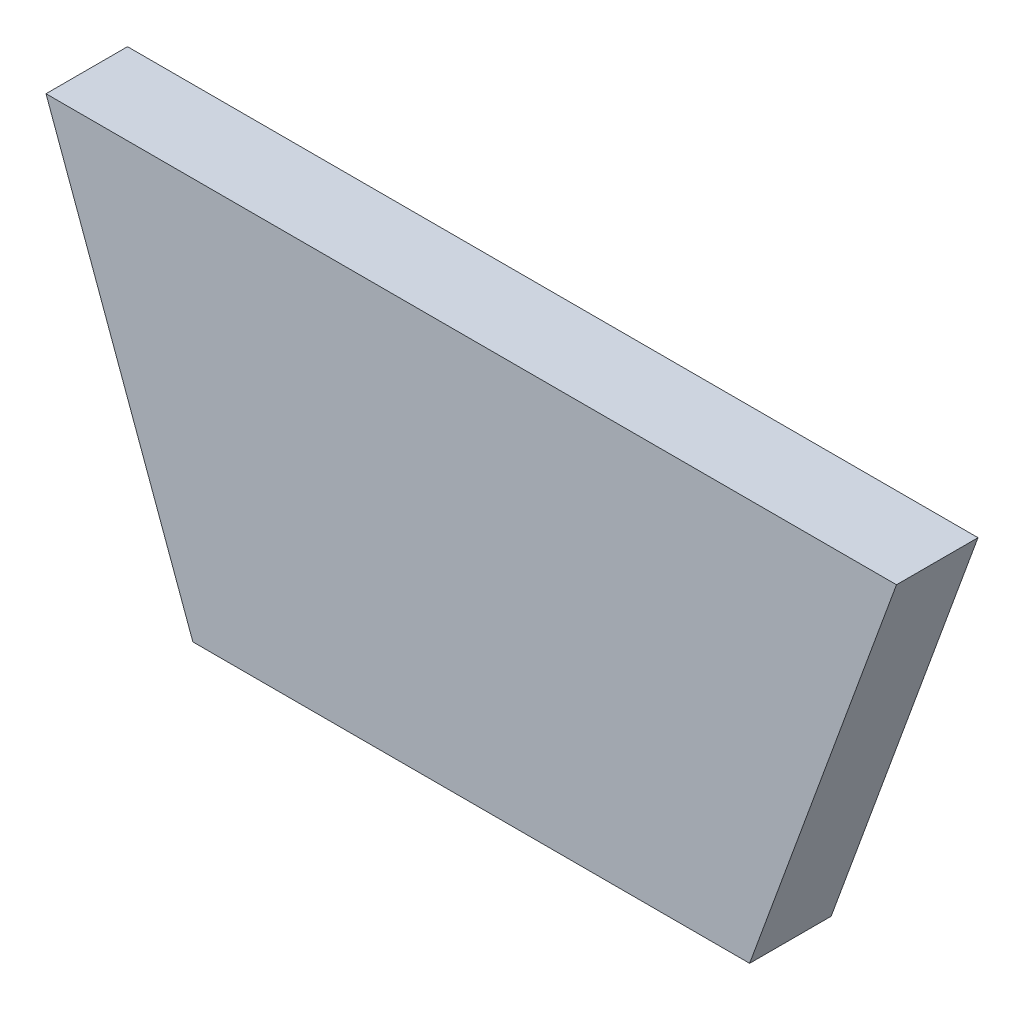
ISO-10303-21;
HEADER;
FILE_DESCRIPTION(('STEP AP214'),'2;1');
FILE_NAME('part.step','',(''),(''),'','','');
FILE_SCHEMA(('AUTOMOTIVE_DESIGN { 1 0 10303 214 1 1 1 1 }'));
ENDSEC;
DATA;
#1=APPLICATION_CONTEXT('core data for automotive mechanical design processes');
#2=APPLICATION_PROTOCOL_DEFINITION('international standard','automotive_design',2000,#1);
#3=PRODUCT_CONTEXT('',#1,'mechanical');
#4=PRODUCT('Part','Part','',(#3));
#5=PRODUCT_RELATED_PRODUCT_CATEGORY('part','',(#4));
#6=PRODUCT_DEFINITION_FORMATION('','',#4);
#7=PRODUCT_DEFINITION_CONTEXT('part definition',#1,'design');
#8=PRODUCT_DEFINITION('design','',#6,#7);
#9=PRODUCT_DEFINITION_SHAPE('','',#8);
#10=(LENGTH_UNIT() NAMED_UNIT(*) SI_UNIT(.MILLI.,.METRE.));
#11=(NAMED_UNIT(*) PLANE_ANGLE_UNIT() SI_UNIT($,.RADIAN.));
#12=(NAMED_UNIT(*) SI_UNIT($,.STERADIAN.) SOLID_ANGLE_UNIT());
#13=UNCERTAINTY_MEASURE_WITH_UNIT(LENGTH_MEASURE(1.E-05),#10,'distance_accuracy_value','');
#14=(GEOMETRIC_REPRESENTATION_CONTEXT(3) GLOBAL_UNCERTAINTY_ASSIGNED_CONTEXT((#13)) GLOBAL_UNIT_ASSIGNED_CONTEXT((#10,
#11,#12)) REPRESENTATION_CONTEXT('',''));
#15=CARTESIAN_POINT('',(0.,0.,0.));
#16=DIRECTION('',(0.,0.,1.));
#17=DIRECTION('',(1.,0.,0.));
#18=AXIS2_PLACEMENT_3D('',#15,#16,#17);
#19=CARTESIAN_POINT('',(-0.35124129089165,-2.531225637262,0.));
#20=DIRECTION('',(0.939091646326947,-0.343666815097041,0.));
#21=DIRECTION('',(0.343666815097041,0.939091646326947,0.));
#22=AXIS2_PLACEMENT_3D('',#19,#20,#21);
#23=PLANE('',#22);
#24=DIRECTION('',(0.343666815097041,0.939091646326947,0.));
#25=VECTOR('',#24,1.);
#26=CARTESIAN_POINT('',(-0.35124129089165,-2.531225637262,0.));
#27=LINE('',#26,#25);
#28=CARTESIAN_POINT('',(-0.35124129089165,-2.531225637262,0.));
#29=VERTEX_POINT('',#28);
#30=CARTESIAN_POINT('',(-0.171073961163969,-2.038906836447,0.));
#31=VERTEX_POINT('',#30);
#32=EDGE_CURVE('E11',#29,#31,#27,.T.);
#33=ORIENTED_EDGE('',*,*,#32,.T.);
#34=DIRECTION('',(0.,0.,1.));
#35=VECTOR('',#34,1.);
#36=CARTESIAN_POINT('',(-0.171073961163969,-2.038906836447,0.));
#37=LINE('',#36,#35);
#38=CARTESIAN_POINT('',(-0.171073961163969,-2.038906836447,0.1));
#39=VERTEX_POINT('',#38);
#40=EDGE_CURVE('E24',#31,#39,#37,.T.);
#41=ORIENTED_EDGE('',*,*,#40,.T.);
#42=DIRECTION('',(0.343666815097041,0.939091646326947,0.));
#43=VECTOR('',#42,1.);
#44=CARTESIAN_POINT('',(-0.35124129089165,-2.531225637262,0.1));
#45=LINE('',#44,#43);
#46=CARTESIAN_POINT('',(-0.35124129089165,-2.531225637262,0.1));
#47=VERTEX_POINT('',#46);
#48=EDGE_CURVE('E75',#47,#39,#45,.T.);
#49=ORIENTED_EDGE('',*,*,#48,.F.);
#50=DIRECTION('',(0.,0.,1.));
#51=VECTOR('',#50,1.);
#52=CARTESIAN_POINT('',(-0.35124129089165,-2.531225637262,0.));
#53=LINE('',#52,#51);
#54=EDGE_CURVE('E86',#29,#47,#53,.T.);
#55=ORIENTED_EDGE('',*,*,#54,.F.);
#56=EDGE_LOOP('',(#33,#41,#49,#55));
#57=FACE_BOUND('',#56,.T.);
#58=ADVANCED_FACE('F17',(#57),#23,.T.);
#59=CARTESIAN_POINT('',(-1.034246323501,-2.531225637262,0.));
#60=DIRECTION('',(0.,-1.,0.));
#61=DIRECTION('',(1.,0.,0.));
#62=AXIS2_PLACEMENT_3D('',#59,#60,#61);
#63=PLANE('',#62);
#64=DIRECTION('',(1.,0.,0.));
#65=VECTOR('',#64,1.);
#66=CARTESIAN_POINT('',(-1.034246323501,-2.531225637262,0.));
#67=LINE('',#66,#65);
#68=CARTESIAN_POINT('',(-1.034246323501,-2.531225637262,0.));
#69=VERTEX_POINT('',#68);
#70=EDGE_CURVE('E83',#69,#29,#67,.T.);
#71=ORIENTED_EDGE('',*,*,#70,.T.);
#72=ORIENTED_EDGE('',*,*,#54,.T.);
#73=DIRECTION('',(1.,0.,0.));
#74=VECTOR('',#73,1.);
#75=CARTESIAN_POINT('',(-1.034246323501,-2.531225637262,0.1));
#76=LINE('',#75,#74);
#77=CARTESIAN_POINT('',(-1.034246323501,-2.531225637262,0.1));
#78=VERTEX_POINT('',#77);
#79=EDGE_CURVE('E81',#78,#47,#76,.T.);
#80=ORIENTED_EDGE('',*,*,#79,.F.);
#81=DIRECTION('',(0.,0.,1.));
#82=VECTOR('',#81,1.);
#83=CARTESIAN_POINT('',(-1.034246323501,-2.531225637262,0.));
#84=LINE('',#83,#82);
#85=EDGE_CURVE('E61',#69,#78,#84,.T.);
#86=ORIENTED_EDGE('',*,*,#85,.F.);
#87=EDGE_LOOP('',(#71,#72,#80,#86));
#88=FACE_BOUND('',#87,.T.);
#89=ADVANCED_FACE('F91',(#88),#63,.T.);
#90=CARTESIAN_POINT('',(-1.214413653228,-2.038906836447,0.));
#91=DIRECTION('',(-0.939091646326948,-0.343666815097038,0.));
#92=DIRECTION('',(0.343666815097038,-0.939091646326948,0.));
#93=AXIS2_PLACEMENT_3D('',#90,#91,#92);
#94=PLANE('',#93);
#95=DIRECTION('',(0.343666815097038,-0.939091646326948,0.));
#96=VECTOR('',#95,1.);
#97=CARTESIAN_POINT('',(-1.214413653228,-2.038906836447,0.));
#98=LINE('',#97,#96);
#99=CARTESIAN_POINT('',(-1.214413653228,-2.038906836447,0.));
#100=VERTEX_POINT('',#99);
#101=EDGE_CURVE('E65',#100,#69,#98,.T.);
#102=ORIENTED_EDGE('',*,*,#101,.T.);
#103=ORIENTED_EDGE('',*,*,#85,.T.);
#104=DIRECTION('',(0.343666815097038,-0.939091646326948,0.));
#105=VECTOR('',#104,1.);
#106=CARTESIAN_POINT('',(-1.214413653228,-2.038906836447,0.1));
#107=LINE('',#106,#105);
#108=CARTESIAN_POINT('',(-1.214413653228,-2.038906836447,0.1));
#109=VERTEX_POINT('',#108);
#110=EDGE_CURVE('E54',#109,#78,#107,.T.);
#111=ORIENTED_EDGE('',*,*,#110,.F.);
#112=DIRECTION('',(0.,0.,1.));
#113=VECTOR('',#112,1.);
#114=CARTESIAN_POINT('',(-1.214413653228,-2.038906836447,0.));
#115=LINE('',#114,#113);
#116=EDGE_CURVE('E58',#100,#109,#115,.T.);
#117=ORIENTED_EDGE('',*,*,#116,.F.);
#118=EDGE_LOOP('',(#102,#103,#111,#117));
#119=FACE_BOUND('',#118,.T.);
#120=ADVANCED_FACE('F57',(#119),#94,.T.);
#121=CARTESIAN_POINT('',(-0.171073961163969,-2.038906836447,0.));
#122=DIRECTION('',(0.,1.,0.));
#123=DIRECTION('',(-1.,0.,0.));
#124=AXIS2_PLACEMENT_3D('',#121,#122,#123);
#125=PLANE('',#124);
#126=DIRECTION('',(-1.,0.,0.));
#127=VECTOR('',#126,1.);
#128=CARTESIAN_POINT('',(-0.171073961163969,-2.038906836447,0.));
#129=LINE('',#128,#127);
#130=EDGE_CURVE('E71',#31,#100,#129,.T.);
#131=ORIENTED_EDGE('',*,*,#130,.T.);
#132=ORIENTED_EDGE('',*,*,#116,.T.);
#133=DIRECTION('',(-1.,0.,0.));
#134=VECTOR('',#133,1.);
#135=CARTESIAN_POINT('',(-0.171073961163969,-2.038906836447,0.1));
#136=LINE('',#135,#134);
#137=EDGE_CURVE('E70',#39,#109,#136,.T.);
#138=ORIENTED_EDGE('',*,*,#137,.F.);
#139=ORIENTED_EDGE('',*,*,#40,.F.);
#140=EDGE_LOOP('',(#131,#132,#138,#139));
#141=FACE_BOUND('',#140,.T.);
#142=ADVANCED_FACE('F69',(#141),#125,.T.);
#143=CARTESIAN_POINT('',(-0.692743807196208,-2.253100569525,0.1));
#144=DIRECTION('',(0.,0.,1.));
#145=DIRECTION('',(1.,0.,0.));
#146=AXIS2_PLACEMENT_3D('',#143,#144,#145);
#147=PLANE('',#146);
#148=ORIENTED_EDGE('',*,*,#137,.T.);
#149=ORIENTED_EDGE('',*,*,#110,.T.);
#150=ORIENTED_EDGE('',*,*,#79,.T.);
#151=ORIENTED_EDGE('',*,*,#48,.T.);
#152=EDGE_LOOP('',(#148,#149,#150,#151));
#153=FACE_BOUND('',#152,.T.);
#154=ADVANCED_FACE('F74',(#153),#147,.T.);
#155=CARTESIAN_POINT('',(-0.692743807196208,-2.253100569525,0.));
#156=DIRECTION('',(0.,0.,1.));
#157=DIRECTION('',(1.,0.,0.));
#158=AXIS2_PLACEMENT_3D('',#155,#156,#157);
#159=PLANE('',#158);
#160=ORIENTED_EDGE('',*,*,#130,.F.);
#161=ORIENTED_EDGE('',*,*,#32,.F.);
#162=ORIENTED_EDGE('',*,*,#70,.F.);
#163=ORIENTED_EDGE('',*,*,#101,.F.);
#164=EDGE_LOOP('',(#160,#161,#162,#163));
#165=FACE_BOUND('',#164,.T.);
#166=ADVANCED_FACE('F89',(#165),#159,.F.);
#167=CLOSED_SHELL('',(#58,#89,#120,#142,#154,#166));
#168=MANIFOLD_SOLID_BREP('B1',#167);
#169=ADVANCED_BREP_SHAPE_REPRESENTATION('',(#18,#168),#14);
#170=SHAPE_DEFINITION_REPRESENTATION(#9,#169);
ENDSEC;
END-ISO-10303-21;
